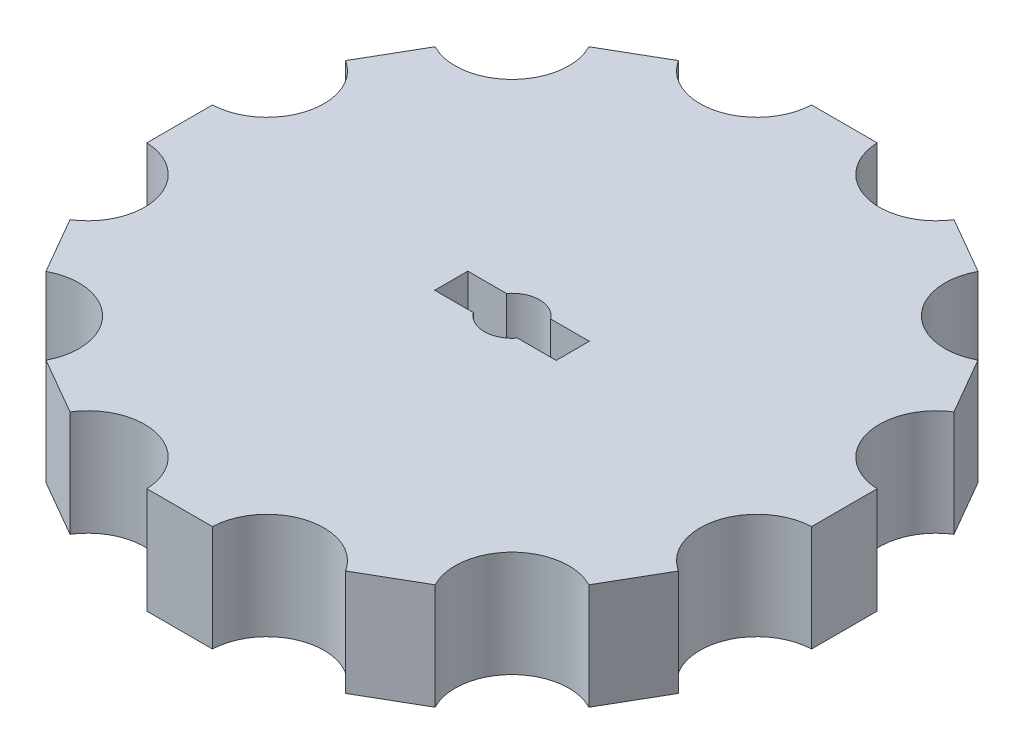
ISO-10303-21;
HEADER;
FILE_DESCRIPTION(('STEP AP214'),'2;1');
FILE_NAME('part.step','',(''),(''),'','','');
FILE_SCHEMA(('AUTOMOTIVE_DESIGN { 1 0 10303 214 1 1 1 1 }'));
ENDSEC;
DATA;
#1=APPLICATION_CONTEXT('core data for automotive mechanical design processes');
#2=APPLICATION_PROTOCOL_DEFINITION('international standard','automotive_design',2000,#1);
#3=PRODUCT_CONTEXT('',#1,'mechanical');
#4=PRODUCT('Part','Part','',(#3));
#5=PRODUCT_RELATED_PRODUCT_CATEGORY('part','',(#4));
#6=PRODUCT_DEFINITION_FORMATION('','',#4);
#7=PRODUCT_DEFINITION_CONTEXT('part definition',#1,'design');
#8=PRODUCT_DEFINITION('design','',#6,#7);
#9=PRODUCT_DEFINITION_SHAPE('','',#8);
#10=(LENGTH_UNIT() NAMED_UNIT(*) SI_UNIT(.MILLI.,.METRE.));
#11=(NAMED_UNIT(*) PLANE_ANGLE_UNIT() SI_UNIT($,.RADIAN.));
#12=(NAMED_UNIT(*) SI_UNIT($,.STERADIAN.) SOLID_ANGLE_UNIT());
#13=UNCERTAINTY_MEASURE_WITH_UNIT(LENGTH_MEASURE(1.E-05),#10,'distance_accuracy_value','');
#14=(GEOMETRIC_REPRESENTATION_CONTEXT(3) GLOBAL_UNCERTAINTY_ASSIGNED_CONTEXT((#13)) GLOBAL_UNIT_ASSIGNED_CONTEXT((#10,
#11,#12)) REPRESENTATION_CONTEXT('',''));
#15=CARTESIAN_POINT('',(0.,0.,0.));
#16=DIRECTION('',(0.,0.,1.));
#17=DIRECTION('',(1.,0.,0.));
#18=AXIS2_PLACEMENT_3D('',#15,#16,#17);
#19=CARTESIAN_POINT('',(-22.1705923034211,9.6,-22.1705923034217));
#20=DIRECTION('',(0.,-1.,0.));
#21=DIRECTION('',(0.,0.,-1.));
#22=AXIS2_PLACEMENT_3D('',#19,#20,#21);
#23=CYLINDRICAL_SURFACE('',#22,5.15);
#24=CARTESIAN_POINT('',(-22.1705923034211,0.,-22.1705923034217));
#25=DIRECTION('',(0.,1.,0.));
#26=DIRECTION('',(0.,0.,1.));
#27=AXIS2_PLACEMENT_3D('',#24,#25,#26);
#28=CIRCLE('',#27,5.15);
#29=CARTESIAN_POINT('',(-24.5704447424256,0.,-17.6139259483981));
#30=VERTEX_POINT('',#29);
#31=CARTESIAN_POINT('',(-17.6139259483974,0.,-24.570444742426));
#32=VERTEX_POINT('',#31);
#33=EDGE_CURVE('E328',#30,#32,#28,.T.);
#34=ORIENTED_EDGE('',*,*,#33,.F.);
#35=DIRECTION('',(0.,-1.,0.));
#36=VECTOR('',#35,1.);
#37=CARTESIAN_POINT('',(-24.5704447424256,9.6,-17.6139259483981));
#38=LINE('',#37,#36);
#39=CARTESIAN_POINT('',(-24.5704447424256,9.6,-17.6139259483981));
#40=VERTEX_POINT('',#39);
#41=EDGE_CURVE('E11',#40,#30,#38,.T.);
#42=ORIENTED_EDGE('',*,*,#41,.F.);
#43=CARTESIAN_POINT('',(-22.1705923034211,9.6,-22.1705923034217));
#44=DIRECTION('',(0.,1.,0.));
#45=DIRECTION('',(0.,0.,1.));
#46=AXIS2_PLACEMENT_3D('',#43,#44,#45);
#47=CIRCLE('',#46,5.15);
#48=CARTESIAN_POINT('',(-17.6139259483974,9.6,-24.570444742426));
#49=VERTEX_POINT('',#48);
#50=EDGE_CURVE('E346',#40,#49,#47,.T.);
#51=ORIENTED_EDGE('',*,*,#50,.T.);
#52=DIRECTION('',(0.,-1.,0.));
#53=VECTOR('',#52,1.);
#54=CARTESIAN_POINT('',(-17.6139259483974,9.6,-24.570444742426));
#55=LINE('',#54,#53);
#56=EDGE_CURVE('E431',#49,#32,#55,.T.);
#57=ORIENTED_EDGE('',*,*,#56,.T.);
#58=EDGE_LOOP('',(#34,#42,#51,#57));
#59=FACE_BOUND('',#58,.T.);
#60=ADVANCED_FACE('F45',(#59),#23,.F.);
#61=CARTESIAN_POINT('',(-26.0548872226646,9.6,-15.0427961517107));
#62=DIRECTION('',(0.866025403784438,0.,0.5));
#63=DIRECTION('',(0.500000000000001,0.,-0.866025403784438));
#64=AXIS2_PLACEMENT_3D('',#61,#62,#63);
#65=PLANE('',#64);
#66=DIRECTION('',(-0.500000000000001,0.,0.866025403784438));
#67=VECTOR('',#66,1.);
#68=CARTESIAN_POINT('',(-26.0548872226646,0.,-15.0427961517107));
#69=LINE('',#68,#67);
#70=CARTESIAN_POINT('',(-27.5393297029031,0.,-12.471666355024));
#71=VERTEX_POINT('',#70);
#72=EDGE_CURVE('E435',#30,#71,#69,.T.);
#73=ORIENTED_EDGE('',*,*,#72,.T.);
#74=DIRECTION('',(0.,-1.,0.));
#75=VECTOR('',#74,1.);
#76=CARTESIAN_POINT('',(-27.5393297029031,9.6,-12.471666355024));
#77=LINE('',#76,#75);
#78=CARTESIAN_POINT('',(-27.5393297029031,9.6,-12.471666355024));
#79=VERTEX_POINT('',#78);
#80=EDGE_CURVE('E53',#79,#71,#77,.T.);
#81=ORIENTED_EDGE('',*,*,#80,.F.);
#82=DIRECTION('',(-0.500000000000001,0.,0.866025403784438));
#83=VECTOR('',#82,1.);
#84=CARTESIAN_POINT('',(-26.0548872226646,9.6,-15.0427961517107));
#85=LINE('',#84,#83);
#86=EDGE_CURVE('E350',#40,#79,#85,.T.);
#87=ORIENTED_EDGE('',*,*,#86,.F.);
#88=ORIENTED_EDGE('',*,*,#41,.T.);
#89=EDGE_LOOP('',(#73,#81,#87,#88));
#90=FACE_BOUND('',#89,.T.);
#91=ADVANCED_FACE('F599',(#90),#65,.F.);
#92=CARTESIAN_POINT('',(-30.2855923034213,9.6,-8.11500000000034));
#93=DIRECTION('',(0.,-1.,0.));
#94=DIRECTION('',(0.,0.,-1.));
#95=AXIS2_PLACEMENT_3D('',#92,#93,#94);
#96=CYLINDRICAL_SURFACE('',#95,5.15);
#97=CARTESIAN_POINT('',(-30.2855923034213,0.,-8.11500000000034));
#98=DIRECTION('',(0.,1.,0.));
#99=DIRECTION('',(0.,0.,1.));
#100=AXIS2_PLACEMENT_3D('',#97,#98,#99);
#101=CIRCLE('',#100,5.15);
#102=CARTESIAN_POINT('',(-30.0855923034215,0.,-2.9688849604778));
#103=VERTEX_POINT('',#102);
#104=EDGE_CURVE('E439',#103,#71,#101,.T.);
#105=ORIENTED_EDGE('',*,*,#104,.F.);
#106=DIRECTION('',(0.,-1.,0.));
#107=VECTOR('',#106,1.);
#108=CARTESIAN_POINT('',(-30.0855923034215,9.6,-2.9688849604778));
#109=LINE('',#108,#107);
#110=CARTESIAN_POINT('',(-30.0855923034215,9.6,-2.9688849604778));
#111=VERTEX_POINT('',#110);
#112=EDGE_CURVE('E588',#111,#103,#109,.T.);
#113=ORIENTED_EDGE('',*,*,#112,.F.);
#114=CARTESIAN_POINT('',(-30.2855923034213,9.6,-8.11500000000034));
#115=DIRECTION('',(0.,1.,0.));
#116=DIRECTION('',(0.,0.,1.));
#117=AXIS2_PLACEMENT_3D('',#114,#115,#116);
#118=CIRCLE('',#117,5.15);
#119=EDGE_CURVE('E354',#111,#79,#118,.T.);
#120=ORIENTED_EDGE('',*,*,#119,.T.);
#121=ORIENTED_EDGE('',*,*,#80,.T.);
#122=EDGE_LOOP('',(#105,#113,#120,#121));
#123=FACE_BOUND('',#122,.T.);
#124=ADVANCED_FACE('F594',(#123),#96,.F.);
#125=CARTESIAN_POINT('',(-30.0855923034215,9.6,2.38238105315562E-13));
#126=DIRECTION('',(1.,0.,0.));
#127=DIRECTION('',(0.,0.,-1.));
#128=AXIS2_PLACEMENT_3D('',#125,#126,#127);
#129=PLANE('',#128);
#130=DIRECTION('',(0.,0.,1.));
#131=VECTOR('',#130,1.);
#132=CARTESIAN_POINT('',(-30.0855923034215,0.,2.38238105315562E-13));
#133=LINE('',#132,#131);
#134=CARTESIAN_POINT('',(-30.0855923034214,0.,2.96888496047715));
#135=VERTEX_POINT('',#134);
#136=EDGE_CURVE('E443',#103,#135,#133,.T.);
#137=ORIENTED_EDGE('',*,*,#136,.T.);
#138=DIRECTION('',(0.,-1.,0.));
#139=VECTOR('',#138,1.);
#140=CARTESIAN_POINT('',(-30.0855923034214,9.6,2.96888496047715));
#141=LINE('',#140,#139);
#142=CARTESIAN_POINT('',(-30.0855923034214,9.6,2.96888496047715));
#143=VERTEX_POINT('',#142);
#144=EDGE_CURVE('E585',#143,#135,#141,.T.);
#145=ORIENTED_EDGE('',*,*,#144,.F.);
#146=DIRECTION('',(0.,0.,1.));
#147=VECTOR('',#146,1.);
#148=CARTESIAN_POINT('',(-30.0855923034215,9.6,2.38238105315562E-13));
#149=LINE('',#148,#147);
#150=EDGE_CURVE('E358',#111,#143,#149,.T.);
#151=ORIENTED_EDGE('',*,*,#150,.F.);
#152=ORIENTED_EDGE('',*,*,#112,.T.);
#153=EDGE_LOOP('',(#137,#145,#151,#152));
#154=FACE_BOUND('',#153,.T.);
#155=ADVANCED_FACE('F606',(#154),#129,.F.);
#156=CARTESIAN_POINT('',(-30.2855923034215,9.6,8.11499999999968));
#157=DIRECTION('',(0.,-1.,0.));
#158=DIRECTION('',(0.,0.,-1.));
#159=AXIS2_PLACEMENT_3D('',#156,#157,#158);
#160=CYLINDRICAL_SURFACE('',#159,5.15);
#161=CARTESIAN_POINT('',(-30.2855923034215,0.,8.11499999999968));
#162=DIRECTION('',(0.,1.,0.));
#163=DIRECTION('',(0.,0.,1.));
#164=AXIS2_PLACEMENT_3D('',#161,#162,#163);
#165=CIRCLE('',#164,5.15);
#166=CARTESIAN_POINT('',(-27.5393297029035,0.,12.4716663550235));
#167=VERTEX_POINT('',#166);
#168=EDGE_CURVE('E447',#167,#135,#165,.T.);
#169=ORIENTED_EDGE('',*,*,#168,.F.);
#170=DIRECTION('',(0.,-1.,0.));
#171=VECTOR('',#170,1.);
#172=CARTESIAN_POINT('',(-27.5393297029035,9.6,12.4716663550235));
#173=LINE('',#172,#171);
#174=CARTESIAN_POINT('',(-27.5393297029035,9.6,12.4716663550235));
#175=VERTEX_POINT('',#174);
#176=EDGE_CURVE('E582',#175,#167,#173,.T.);
#177=ORIENTED_EDGE('',*,*,#176,.F.);
#178=CARTESIAN_POINT('',(-30.2855923034215,9.6,8.11499999999968));
#179=DIRECTION('',(0.,1.,0.));
#180=DIRECTION('',(0.,0.,1.));
#181=AXIS2_PLACEMENT_3D('',#178,#179,#180);
#182=CIRCLE('',#181,5.15);
#183=EDGE_CURVE('E361',#175,#143,#182,.T.);
#184=ORIENTED_EDGE('',*,*,#183,.T.);
#185=ORIENTED_EDGE('',*,*,#144,.T.);
#186=EDGE_LOOP('',(#169,#177,#184,#185));
#187=FACE_BOUND('',#186,.T.);
#188=ADVANCED_FACE('F698',(#187),#160,.F.);
#189=CARTESIAN_POINT('',(-26.0548872226644,9.6,15.0427961517111));
#190=DIRECTION('',(0.866025403784432,0.,-0.500000000000011));
#191=DIRECTION('',(-0.500000000000011,0.,-0.866025403784432));
#192=AXIS2_PLACEMENT_3D('',#189,#190,#191);
#193=PLANE('',#192);
#194=DIRECTION('',(0.500000000000011,0.,0.866025403784432));
#195=VECTOR('',#194,1.);
#196=CARTESIAN_POINT('',(-26.0548872226644,0.,15.0427961517111));
#197=LINE('',#196,#195);
#198=CARTESIAN_POINT('',(-24.570444742426,0.,17.6139259483975));
#199=VERTEX_POINT('',#198);
#200=EDGE_CURVE('E451',#167,#199,#197,.T.);
#201=ORIENTED_EDGE('',*,*,#200,.T.);
#202=DIRECTION('',(0.,-1.,0.));
#203=VECTOR('',#202,1.);
#204=CARTESIAN_POINT('',(-24.570444742426,9.6,17.6139259483975));
#205=LINE('',#204,#203);
#206=CARTESIAN_POINT('',(-24.570444742426,9.6,17.6139259483975));
#207=VERTEX_POINT('',#206);
#208=EDGE_CURVE('E579',#207,#199,#205,.T.);
#209=ORIENTED_EDGE('',*,*,#208,.F.);
#210=DIRECTION('',(0.500000000000011,0.,0.866025403784432));
#211=VECTOR('',#210,1.);
#212=CARTESIAN_POINT('',(-26.0548872226644,9.6,15.0427961517111));
#213=LINE('',#212,#211);
#214=EDGE_CURVE('E365',#175,#207,#213,.T.);
#215=ORIENTED_EDGE('',*,*,#214,.F.);
#216=ORIENTED_EDGE('',*,*,#176,.T.);
#217=EDGE_LOOP('',(#201,#209,#215,#216));
#218=FACE_BOUND('',#217,.T.);
#219=ADVANCED_FACE('F696',(#218),#193,.F.);
#220=CARTESIAN_POINT('',(-22.1705923034216,9.6,22.1705923034212));
#221=DIRECTION('',(0.,-1.,0.));
#222=DIRECTION('',(0.,0.,-1.));
#223=AXIS2_PLACEMENT_3D('',#220,#221,#222);
#224=CYLINDRICAL_SURFACE('',#223,5.15);
#225=CARTESIAN_POINT('',(-22.1705923034216,0.,22.1705923034212));
#226=DIRECTION('',(0.,1.,0.));
#227=DIRECTION('',(0.,0.,1.));
#228=AXIS2_PLACEMENT_3D('',#225,#226,#227);
#229=CIRCLE('',#228,5.15);
#230=CARTESIAN_POINT('',(-17.613925948398,0.,24.5704447424258));
#231=VERTEX_POINT('',#230);
#232=EDGE_CURVE('E455',#231,#199,#229,.T.);
#233=ORIENTED_EDGE('',*,*,#232,.F.);
#234=DIRECTION('',(0.,-1.,0.));
#235=VECTOR('',#234,1.);
#236=CARTESIAN_POINT('',(-17.613925948398,9.6,24.5704447424258));
#237=LINE('',#236,#235);
#238=CARTESIAN_POINT('',(-17.613925948398,9.6,24.5704447424258));
#239=VERTEX_POINT('',#238);
#240=EDGE_CURVE('E576',#239,#231,#237,.T.);
#241=ORIENTED_EDGE('',*,*,#240,.F.);
#242=CARTESIAN_POINT('',(-22.1705923034216,9.6,22.1705923034212));
#243=DIRECTION('',(0.,1.,0.));
#244=DIRECTION('',(0.,0.,1.));
#245=AXIS2_PLACEMENT_3D('',#242,#243,#244);
#246=CIRCLE('',#245,5.15);
#247=EDGE_CURVE('E368',#239,#207,#246,.T.);
#248=ORIENTED_EDGE('',*,*,#247,.T.);
#249=ORIENTED_EDGE('',*,*,#208,.T.);
#250=EDGE_LOOP('',(#233,#241,#248,#249));
#251=FACE_BOUND('',#250,.T.);
#252=ADVANCED_FACE('F691',(#251),#224,.F.);
#253=CARTESIAN_POINT('',(-15.0427961517103,9.6,26.0548872226648));
#254=DIRECTION('',(0.499999999999986,0.,-0.866025403784447));
#255=DIRECTION('',(-0.866025403784447,0.,-0.499999999999986));
#256=AXIS2_PLACEMENT_3D('',#253,#254,#255);
#257=PLANE('',#256);
#258=DIRECTION('',(0.866025403784447,0.,0.499999999999986));
#259=VECTOR('',#258,1.);
#260=CARTESIAN_POINT('',(-15.0427961517103,0.,26.0548872226648));
#261=LINE('',#260,#259);
#262=CARTESIAN_POINT('',(-12.4716663550239,0.,27.5393297029031));
#263=VERTEX_POINT('',#262);
#264=EDGE_CURVE('E459',#231,#263,#261,.T.);
#265=ORIENTED_EDGE('',*,*,#264,.T.);
#266=DIRECTION('',(0.,-1.,0.));
#267=VECTOR('',#266,1.);
#268=CARTESIAN_POINT('',(-12.4716663550239,9.6,27.5393297029031));
#269=LINE('',#268,#267);
#270=CARTESIAN_POINT('',(-12.4716663550239,9.6,27.5393297029031));
#271=VERTEX_POINT('',#270);
#272=EDGE_CURVE('E573',#271,#263,#269,.T.);
#273=ORIENTED_EDGE('',*,*,#272,.F.);
#274=DIRECTION('',(0.866025403784447,0.,0.499999999999986));
#275=VECTOR('',#274,1.);
#276=CARTESIAN_POINT('',(-15.0427961517103,9.6,26.0548872226648));
#277=LINE('',#276,#275);
#278=EDGE_CURVE('E372',#239,#271,#277,.T.);
#279=ORIENTED_EDGE('',*,*,#278,.F.);
#280=ORIENTED_EDGE('',*,*,#240,.T.);
#281=EDGE_LOOP('',(#265,#273,#279,#280));
#282=FACE_BOUND('',#281,.T.);
#283=ADVANCED_FACE('F688',(#282),#257,.F.);
#284=CARTESIAN_POINT('',(-8.11500000000024,9.6,30.2855923034213));
#285=DIRECTION('',(0.,-1.,0.));
#286=DIRECTION('',(0.,0.,-1.));
#287=AXIS2_PLACEMENT_3D('',#284,#285,#286);
#288=CYLINDRICAL_SURFACE('',#287,5.15);
#289=CARTESIAN_POINT('',(-8.11500000000024,0.,30.2855923034213));
#290=DIRECTION('',(0.,1.,0.));
#291=DIRECTION('',(0.,0.,1.));
#292=AXIS2_PLACEMENT_3D('',#289,#290,#291);
#293=CIRCLE('',#292,5.15);
#294=CARTESIAN_POINT('',(-2.9688849604777,0.,30.0855923034215));
#295=VERTEX_POINT('',#294);
#296=EDGE_CURVE('E463',#295,#263,#293,.T.);
#297=ORIENTED_EDGE('',*,*,#296,.F.);
#298=DIRECTION('',(0.,-1.,0.));
#299=VECTOR('',#298,1.);
#300=CARTESIAN_POINT('',(-2.9688849604777,9.6,30.0855923034215));
#301=LINE('',#300,#299);
#302=CARTESIAN_POINT('',(-2.9688849604777,9.6,30.0855923034215));
#303=VERTEX_POINT('',#302);
#304=EDGE_CURVE('E570',#303,#295,#301,.T.);
#305=ORIENTED_EDGE('',*,*,#304,.F.);
#306=CARTESIAN_POINT('',(-8.11500000000024,9.6,30.2855923034213));
#307=DIRECTION('',(0.,1.,0.));
#308=DIRECTION('',(0.,0.,1.));
#309=AXIS2_PLACEMENT_3D('',#306,#307,#308);
#310=CIRCLE('',#309,5.15);
#311=EDGE_CURVE('E375',#303,#271,#310,.T.);
#312=ORIENTED_EDGE('',*,*,#311,.T.);
#313=ORIENTED_EDGE('',*,*,#272,.T.);
#314=EDGE_LOOP('',(#297,#305,#312,#313));
#315=FACE_BOUND('',#314,.T.);
#316=ADVANCED_FACE('F683',(#315),#288,.F.);
#317=CARTESIAN_POINT('',(4.42442195586083E-13,9.6,30.0855923034215));
#318=DIRECTION('',(0.,0.,-1.));
#319=DIRECTION('',(-1.,0.,0.));
#320=AXIS2_PLACEMENT_3D('',#317,#318,#319);
#321=PLANE('',#320);
#322=DIRECTION('',(1.,0.,0.));
#323=VECTOR('',#322,1.);
#324=CARTESIAN_POINT('',(4.42442195586083E-13,0.,30.0855923034215));
#325=LINE('',#324,#323);
#326=CARTESIAN_POINT('',(2.96888496047725,0.,30.0855923034214));
#327=VERTEX_POINT('',#326);
#328=EDGE_CURVE('E467',#295,#327,#325,.T.);
#329=ORIENTED_EDGE('',*,*,#328,.T.);
#330=DIRECTION('',(0.,-1.,0.));
#331=VECTOR('',#330,1.);
#332=CARTESIAN_POINT('',(2.96888496047725,9.6,30.0855923034214));
#333=LINE('',#332,#331);
#334=CARTESIAN_POINT('',(2.96888496047725,9.6,30.0855923034214));
#335=VERTEX_POINT('',#334);
#336=EDGE_CURVE('E567',#335,#327,#333,.T.);
#337=ORIENTED_EDGE('',*,*,#336,.F.);
#338=DIRECTION('',(1.,0.,0.));
#339=VECTOR('',#338,1.);
#340=CARTESIAN_POINT('',(4.42442195586083E-13,9.6,30.0855923034215));
#341=LINE('',#340,#339);
#342=EDGE_CURVE('E379',#303,#335,#341,.T.);
#343=ORIENTED_EDGE('',*,*,#342,.F.);
#344=ORIENTED_EDGE('',*,*,#304,.T.);
#345=EDGE_LOOP('',(#329,#337,#343,#344));
#346=FACE_BOUND('',#345,.T.);
#347=ADVANCED_FACE('F679',(#346),#321,.F.);
#348=CARTESIAN_POINT('',(8.11499999999978,9.6,30.2855923034215));
#349=DIRECTION('',(0.,-1.,0.));
#350=DIRECTION('',(0.,0.,-1.));
#351=AXIS2_PLACEMENT_3D('',#348,#349,#350);
#352=CYLINDRICAL_SURFACE('',#351,5.15);
#353=CARTESIAN_POINT('',(8.11499999999978,0.,30.2855923034215));
#354=DIRECTION('',(0.,1.,0.));
#355=DIRECTION('',(0.,0.,1.));
#356=AXIS2_PLACEMENT_3D('',#353,#354,#355);
#357=CIRCLE('',#356,5.15);
#358=CARTESIAN_POINT('',(12.4716663550235,0.,27.5393297029034));
#359=VERTEX_POINT('',#358);
#360=EDGE_CURVE('E471',#359,#327,#357,.T.);
#361=ORIENTED_EDGE('',*,*,#360,.F.);
#362=DIRECTION('',(0.,-1.,0.));
#363=VECTOR('',#362,1.);
#364=CARTESIAN_POINT('',(12.4716663550235,9.6,27.5393297029034));
#365=LINE('',#364,#363);
#366=CARTESIAN_POINT('',(12.4716663550235,9.6,27.5393297029034));
#367=VERTEX_POINT('',#366);
#368=EDGE_CURVE('E564',#367,#359,#365,.T.);
#369=ORIENTED_EDGE('',*,*,#368,.F.);
#370=CARTESIAN_POINT('',(8.11499999999978,9.6,30.2855923034215));
#371=DIRECTION('',(0.,1.,0.));
#372=DIRECTION('',(0.,0.,1.));
#373=AXIS2_PLACEMENT_3D('',#370,#371,#372);
#374=CIRCLE('',#373,5.15);
#375=EDGE_CURVE('E382',#367,#335,#374,.T.);
#376=ORIENTED_EDGE('',*,*,#375,.T.);
#377=ORIENTED_EDGE('',*,*,#336,.T.);
#378=EDGE_LOOP('',(#361,#369,#376,#377));
#379=FACE_BOUND('',#378,.T.);
#380=ADVANCED_FACE('F674',(#379),#352,.F.);
#381=CARTESIAN_POINT('',(15.0427961517111,9.6,26.0548872226644));
#382=DIRECTION('',(-0.500000000000011,0.,-0.866025403784432));
#383=DIRECTION('',(-0.866025403784432,0.,0.500000000000011));
#384=AXIS2_PLACEMENT_3D('',#381,#382,#383);
#385=PLANE('',#384);
#386=DIRECTION('',(0.866025403784432,0.,-0.500000000000011));
#387=VECTOR('',#386,1.);
#388=CARTESIAN_POINT('',(15.0427961517111,0.,26.0548872226644));
#389=LINE('',#388,#387);
#390=CARTESIAN_POINT('',(17.6139259483976,0.,24.5704447424259));
#391=VERTEX_POINT('',#390);
#392=EDGE_CURVE('E475',#359,#391,#389,.T.);
#393=ORIENTED_EDGE('',*,*,#392,.T.);
#394=DIRECTION('',(0.,-1.,0.));
#395=VECTOR('',#394,1.);
#396=CARTESIAN_POINT('',(17.6139259483976,9.6,24.5704447424259));
#397=LINE('',#396,#395);
#398=CARTESIAN_POINT('',(17.6139259483976,9.6,24.5704447424259));
#399=VERTEX_POINT('',#398);
#400=EDGE_CURVE('E561',#399,#391,#397,.T.);
#401=ORIENTED_EDGE('',*,*,#400,.F.);
#402=DIRECTION('',(0.866025403784432,0.,-0.500000000000011));
#403=VECTOR('',#402,1.);
#404=CARTESIAN_POINT('',(15.0427961517111,9.6,26.0548872226644));
#405=LINE('',#404,#403);
#406=EDGE_CURVE('E386',#367,#399,#405,.T.);
#407=ORIENTED_EDGE('',*,*,#406,.F.);
#408=ORIENTED_EDGE('',*,*,#368,.T.);
#409=EDGE_LOOP('',(#393,#401,#407,#408));
#410=FACE_BOUND('',#409,.T.);
#411=ADVANCED_FACE('F670',(#410),#385,.F.);
#412=CARTESIAN_POINT('',(22.1705923034213,9.6,22.1705923034215));
#413=DIRECTION('',(0.,-1.,0.));
#414=DIRECTION('',(0.,0.,-1.));
#415=AXIS2_PLACEMENT_3D('',#412,#413,#414);
#416=CYLINDRICAL_SURFACE('',#415,5.15);
#417=CARTESIAN_POINT('',(22.1705923034213,0.,22.1705923034215));
#418=DIRECTION('',(0.,1.,0.));
#419=DIRECTION('',(0.,0.,1.));
#420=AXIS2_PLACEMENT_3D('',#417,#418,#419);
#421=CIRCLE('',#420,5.15);
#422=CARTESIAN_POINT('',(24.5704447424257,0.,17.6139259483979));
#423=VERTEX_POINT('',#422);
#424=EDGE_CURVE('E479',#423,#391,#421,.T.);
#425=ORIENTED_EDGE('',*,*,#424,.F.);
#426=DIRECTION('',(0.,-1.,0.));
#427=VECTOR('',#426,1.);
#428=CARTESIAN_POINT('',(24.5704447424257,9.6,17.6139259483979));
#429=LINE('',#428,#427);
#430=CARTESIAN_POINT('',(24.5704447424257,9.6,17.6139259483979));
#431=VERTEX_POINT('',#430);
#432=EDGE_CURVE('E558',#431,#423,#429,.T.);
#433=ORIENTED_EDGE('',*,*,#432,.F.);
#434=CARTESIAN_POINT('',(22.1705923034213,9.6,22.1705923034215));
#435=DIRECTION('',(0.,1.,0.));
#436=DIRECTION('',(0.,0.,1.));
#437=AXIS2_PLACEMENT_3D('',#434,#435,#436);
#438=CIRCLE('',#437,5.15);
#439=EDGE_CURVE('E389',#431,#399,#438,.T.);
#440=ORIENTED_EDGE('',*,*,#439,.T.);
#441=ORIENTED_EDGE('',*,*,#400,.T.);
#442=EDGE_LOOP('',(#425,#433,#440,#441));
#443=FACE_BOUND('',#442,.T.);
#444=ADVANCED_FACE('F665',(#443),#416,.F.);
#445=CARTESIAN_POINT('',(26.0548872226646,9.6,15.0427961517106));
#446=DIRECTION('',(-0.86602540378444,0.,-0.499999999999997));
#447=DIRECTION('',(-0.499999999999997,0.,0.86602540378444));
#448=AXIS2_PLACEMENT_3D('',#445,#446,#447);
#449=PLANE('',#448);
#450=DIRECTION('',(0.499999999999997,0.,-0.86602540378444));
#451=VECTOR('',#450,1.);
#452=CARTESIAN_POINT('',(26.0548872226646,0.,15.0427961517106));
#453=LINE('',#452,#451);
#454=CARTESIAN_POINT('',(27.5393297029032,0.,12.4716663550238));
#455=VERTEX_POINT('',#454);
#456=EDGE_CURVE('E483',#423,#455,#453,.T.);
#457=ORIENTED_EDGE('',*,*,#456,.T.);
#458=DIRECTION('',(0.,-1.,0.));
#459=VECTOR('',#458,1.);
#460=CARTESIAN_POINT('',(27.5393297029032,9.6,12.4716663550238));
#461=LINE('',#460,#459);
#462=CARTESIAN_POINT('',(27.5393297029032,9.6,12.4716663550238));
#463=VERTEX_POINT('',#462);
#464=EDGE_CURVE('E555',#463,#455,#461,.T.);
#465=ORIENTED_EDGE('',*,*,#464,.F.);
#466=DIRECTION('',(0.499999999999997,0.,-0.86602540378444));
#467=VECTOR('',#466,1.);
#468=CARTESIAN_POINT('',(26.0548872226646,9.6,15.0427961517106));
#469=LINE('',#468,#467);
#470=EDGE_CURVE('E393',#431,#463,#469,.T.);
#471=ORIENTED_EDGE('',*,*,#470,.F.);
#472=ORIENTED_EDGE('',*,*,#432,.T.);
#473=EDGE_LOOP('',(#457,#465,#471,#472));
#474=FACE_BOUND('',#473,.T.);
#475=ADVANCED_FACE('F661',(#474),#449,.F.);
#476=CARTESIAN_POINT('',(30.2855923034214,9.6,8.11500000000014));
#477=DIRECTION('',(0.,-1.,0.));
#478=DIRECTION('',(0.,0.,-1.));
#479=AXIS2_PLACEMENT_3D('',#476,#477,#478);
#480=CYLINDRICAL_SURFACE('',#479,5.15);
#481=CARTESIAN_POINT('',(30.2855923034214,0.,8.11500000000014));
#482=DIRECTION('',(0.,1.,0.));
#483=DIRECTION('',(0.,0.,1.));
#484=AXIS2_PLACEMENT_3D('',#481,#482,#483);
#485=CIRCLE('',#484,5.15);
#486=CARTESIAN_POINT('',(30.0855923034214,0.,2.9688849604776));
#487=VERTEX_POINT('',#486);
#488=EDGE_CURVE('E487',#487,#455,#485,.T.);
#489=ORIENTED_EDGE('',*,*,#488,.F.);
#490=DIRECTION('',(0.,-1.,0.));
#491=VECTOR('',#490,1.);
#492=CARTESIAN_POINT('',(30.0855923034214,9.6,2.9688849604776));
#493=LINE('',#492,#491);
#494=CARTESIAN_POINT('',(30.0855923034214,9.6,2.9688849604776));
#495=VERTEX_POINT('',#494);
#496=EDGE_CURVE('E552',#495,#487,#493,.T.);
#497=ORIENTED_EDGE('',*,*,#496,.F.);
#498=CARTESIAN_POINT('',(30.2855923034214,9.6,8.11500000000014));
#499=DIRECTION('',(0.,1.,0.));
#500=DIRECTION('',(0.,0.,1.));
#501=AXIS2_PLACEMENT_3D('',#498,#499,#500);
#502=CIRCLE('',#501,5.15);
#503=EDGE_CURVE('E396',#495,#463,#502,.T.);
#504=ORIENTED_EDGE('',*,*,#503,.T.);
#505=ORIENTED_EDGE('',*,*,#464,.T.);
#506=EDGE_LOOP('',(#489,#497,#504,#505));
#507=FACE_BOUND('',#506,.T.);
#508=ADVANCED_FACE('F656',(#507),#480,.F.);
#509=CARTESIAN_POINT('',(30.0855923034214,9.6,-1.23053364365836E-13));
#510=DIRECTION('',(-1.,0.,0.));
#511=DIRECTION('',(0.,0.,1.));
#512=AXIS2_PLACEMENT_3D('',#509,#510,#511);
#513=PLANE('',#512);
#514=DIRECTION('',(0.,0.,-1.));
#515=VECTOR('',#514,1.);
#516=CARTESIAN_POINT('',(30.0855923034214,0.,-1.23053364365836E-13));
#517=LINE('',#516,#515);
#518=CARTESIAN_POINT('',(30.0855923034214,0.,-2.96888496047736));
#519=VERTEX_POINT('',#518);
#520=EDGE_CURVE('E491',#487,#519,#517,.T.);
#521=ORIENTED_EDGE('',*,*,#520,.T.);
#522=DIRECTION('',(0.,-1.,0.));
#523=VECTOR('',#522,1.);
#524=CARTESIAN_POINT('',(30.0855923034214,9.6,-2.96888496047736));
#525=LINE('',#524,#523);
#526=CARTESIAN_POINT('',(30.0855923034214,9.6,-2.96888496047736));
#527=VERTEX_POINT('',#526);
#528=EDGE_CURVE('E549',#527,#519,#525,.T.);
#529=ORIENTED_EDGE('',*,*,#528,.F.);
#530=DIRECTION('',(0.,0.,-1.));
#531=VECTOR('',#530,1.);
#532=CARTESIAN_POINT('',(30.0855923034214,9.6,-1.23053364365836E-13));
#533=LINE('',#532,#531);
#534=EDGE_CURVE('E400',#495,#527,#533,.T.);
#535=ORIENTED_EDGE('',*,*,#534,.F.);
#536=ORIENTED_EDGE('',*,*,#496,.T.);
#537=EDGE_LOOP('',(#521,#529,#535,#536));
#538=FACE_BOUND('',#537,.T.);
#539=ADVANCED_FACE('F652',(#538),#513,.F.);
#540=CARTESIAN_POINT('',(30.2855923034214,9.6,-8.11499999999989));
#541=DIRECTION('',(0.,-1.,0.));
#542=DIRECTION('',(0.,0.,-1.));
#543=AXIS2_PLACEMENT_3D('',#540,#541,#542);
#544=CYLINDRICAL_SURFACE('',#543,5.15);
#545=CARTESIAN_POINT('',(30.2855923034214,0.,-8.11499999999989));
#546=DIRECTION('',(0.,1.,0.));
#547=DIRECTION('',(0.,0.,1.));
#548=AXIS2_PLACEMENT_3D('',#545,#546,#547);
#549=CIRCLE('',#548,5.15);
#550=CARTESIAN_POINT('',(27.5393297029033,0.,-12.4716663550236));
#551=VERTEX_POINT('',#550);
#552=EDGE_CURVE('E495',#551,#519,#549,.T.);
#553=ORIENTED_EDGE('',*,*,#552,.F.);
#554=DIRECTION('',(0.,-1.,0.));
#555=VECTOR('',#554,1.);
#556=CARTESIAN_POINT('',(27.5393297029033,9.6,-12.4716663550236));
#557=LINE('',#556,#555);
#558=CARTESIAN_POINT('',(27.5393297029033,9.6,-12.4716663550236));
#559=VERTEX_POINT('',#558);
#560=EDGE_CURVE('E546',#559,#551,#557,.T.);
#561=ORIENTED_EDGE('',*,*,#560,.F.);
#562=CARTESIAN_POINT('',(30.2855923034214,9.6,-8.11499999999989));
#563=DIRECTION('',(0.,1.,0.));
#564=DIRECTION('',(0.,0.,1.));
#565=AXIS2_PLACEMENT_3D('',#562,#563,#564);
#566=CIRCLE('',#565,5.15);
#567=EDGE_CURVE('E403',#559,#527,#566,.T.);
#568=ORIENTED_EDGE('',*,*,#567,.T.);
#569=ORIENTED_EDGE('',*,*,#528,.T.);
#570=EDGE_LOOP('',(#553,#561,#568,#569));
#571=FACE_BOUND('',#570,.T.);
#572=ADVANCED_FACE('F647',(#571),#544,.F.);
#573=CARTESIAN_POINT('',(26.0548872226646,9.6,-15.0427961517106));
#574=DIRECTION('',(-0.86602540378444,0.,0.499999999999998));
#575=DIRECTION('',(0.499999999999998,0.,0.86602540378444));
#576=AXIS2_PLACEMENT_3D('',#573,#574,#575);
#577=PLANE('',#576);
#578=DIRECTION('',(-0.499999999999998,0.,-0.86602540378444));
#579=VECTOR('',#578,1.);
#580=CARTESIAN_POINT('',(26.0548872226646,0.,-15.0427961517106));
#581=LINE('',#580,#579);
#582=CARTESIAN_POINT('',(24.5704447424258,0.,-17.6139259483977));
#583=VERTEX_POINT('',#582);
#584=EDGE_CURVE('E499',#551,#583,#581,.T.);
#585=ORIENTED_EDGE('',*,*,#584,.T.);
#586=DIRECTION('',(0.,-1.,0.));
#587=VECTOR('',#586,1.);
#588=CARTESIAN_POINT('',(24.5704447424258,9.6,-17.6139259483977));
#589=LINE('',#588,#587);
#590=CARTESIAN_POINT('',(24.5704447424258,9.6,-17.6139259483977));
#591=VERTEX_POINT('',#590);
#592=EDGE_CURVE('E543',#591,#583,#589,.T.);
#593=ORIENTED_EDGE('',*,*,#592,.F.);
#594=DIRECTION('',(-0.499999999999998,0.,-0.86602540378444));
#595=VECTOR('',#594,1.);
#596=CARTESIAN_POINT('',(26.0548872226646,9.6,-15.0427961517106));
#597=LINE('',#596,#595);
#598=EDGE_CURVE('E407',#559,#591,#597,.T.);
#599=ORIENTED_EDGE('',*,*,#598,.F.);
#600=ORIENTED_EDGE('',*,*,#560,.T.);
#601=EDGE_LOOP('',(#585,#593,#599,#600));
#602=FACE_BOUND('',#601,.T.);
#603=ADVANCED_FACE('F643',(#602),#577,.F.);
#604=CARTESIAN_POINT('',(22.1705923034215,9.6,-22.1705923034214));
#605=DIRECTION('',(0.,-1.,0.));
#606=DIRECTION('',(0.,0.,-1.));
#607=AXIS2_PLACEMENT_3D('',#604,#605,#606);
#608=CYLINDRICAL_SURFACE('',#607,5.15);
#609=CARTESIAN_POINT('',(22.1705923034215,0.,-22.1705923034214));
#610=DIRECTION('',(0.,1.,0.));
#611=DIRECTION('',(0.,0.,1.));
#612=AXIS2_PLACEMENT_3D('',#609,#610,#611);
#613=CIRCLE('',#612,5.15);
#614=CARTESIAN_POINT('',(17.6139259483978,0.,-24.5704447424258));
#615=VERTEX_POINT('',#614);
#616=EDGE_CURVE('E503',#615,#583,#613,.T.);
#617=ORIENTED_EDGE('',*,*,#616,.F.);
#618=DIRECTION('',(0.,-1.,0.));
#619=VECTOR('',#618,1.);
#620=CARTESIAN_POINT('',(17.6139259483978,9.6,-24.5704447424258));
#621=LINE('',#620,#619);
#622=CARTESIAN_POINT('',(17.6139259483978,9.6,-24.5704447424258));
#623=VERTEX_POINT('',#622);
#624=EDGE_CURVE('E540',#623,#615,#621,.T.);
#625=ORIENTED_EDGE('',*,*,#624,.F.);
#626=CARTESIAN_POINT('',(22.1705923034215,9.6,-22.1705923034214));
#627=DIRECTION('',(0.,1.,0.));
#628=DIRECTION('',(0.,0.,1.));
#629=AXIS2_PLACEMENT_3D('',#626,#627,#628);
#630=CIRCLE('',#629,5.15);
#631=EDGE_CURVE('E410',#623,#591,#630,.T.);
#632=ORIENTED_EDGE('',*,*,#631,.T.);
#633=ORIENTED_EDGE('',*,*,#592,.T.);
#634=EDGE_LOOP('',(#617,#625,#632,#633));
#635=FACE_BOUND('',#634,.T.);
#636=ADVANCED_FACE('F638',(#635),#608,.F.);
#637=CARTESIAN_POINT('',(15.0427961517107,9.6,-26.0548872226645));
#638=DIRECTION('',(-0.500000000000001,0.,0.866025403784438));
#639=DIRECTION('',(0.866025403784438,0.,0.500000000000001));
#640=AXIS2_PLACEMENT_3D('',#637,#638,#639);
#641=PLANE('',#640);
#642=DIRECTION('',(-0.866025403784438,0.,-0.500000000000001));
#643=VECTOR('',#642,1.);
#644=CARTESIAN_POINT('',(15.0427961517107,0.,-26.0548872226645));
#645=LINE('',#644,#643);
#646=CARTESIAN_POINT('',(12.4716663550237,0.,-27.5393297029032));
#647=VERTEX_POINT('',#646);
#648=EDGE_CURVE('E507',#615,#647,#645,.T.);
#649=ORIENTED_EDGE('',*,*,#648,.T.);
#650=DIRECTION('',(0.,-1.,0.));
#651=VECTOR('',#650,1.);
#652=CARTESIAN_POINT('',(12.4716663550237,9.6,-27.5393297029032));
#653=LINE('',#652,#651);
#654=CARTESIAN_POINT('',(12.4716663550237,9.6,-27.5393297029032));
#655=VERTEX_POINT('',#654);
#656=EDGE_CURVE('E537',#655,#647,#653,.T.);
#657=ORIENTED_EDGE('',*,*,#656,.F.);
#658=DIRECTION('',(-0.866025403784438,0.,-0.500000000000001));
#659=VECTOR('',#658,1.);
#660=CARTESIAN_POINT('',(15.0427961517107,9.6,-26.0548872226645));
#661=LINE('',#660,#659);
#662=EDGE_CURVE('E414',#623,#655,#661,.T.);
#663=ORIENTED_EDGE('',*,*,#662,.F.);
#664=ORIENTED_EDGE('',*,*,#624,.T.);
#665=EDGE_LOOP('',(#649,#657,#663,#664));
#666=FACE_BOUND('',#665,.T.);
#667=ADVANCED_FACE('F634',(#666),#641,.F.);
#668=CARTESIAN_POINT('',(8.11500000000002,9.6,-30.2855923034214));
#669=DIRECTION('',(0.,-1.,0.));
#670=DIRECTION('',(0.,0.,-1.));
#671=AXIS2_PLACEMENT_3D('',#668,#669,#670);
#672=CYLINDRICAL_SURFACE('',#671,5.15);
#673=CARTESIAN_POINT('',(8.11500000000002,0.,-30.2855923034214));
#674=DIRECTION('',(0.,1.,0.));
#675=DIRECTION('',(0.,0.,1.));
#676=AXIS2_PLACEMENT_3D('',#673,#674,#675);
#677=CIRCLE('',#676,5.15);
#678=CARTESIAN_POINT('',(2.96888496047749,0.,-30.0855923034214));
#679=VERTEX_POINT('',#678);
#680=EDGE_CURVE('E511',#679,#647,#677,.T.);
#681=ORIENTED_EDGE('',*,*,#680,.F.);
#682=DIRECTION('',(0.,-1.,0.));
#683=VECTOR('',#682,1.);
#684=CARTESIAN_POINT('',(2.96888496047749,9.6,-30.0855923034214));
#685=LINE('',#684,#683);
#686=CARTESIAN_POINT('',(2.96888496047749,9.6,-30.0855923034214));
#687=VERTEX_POINT('',#686);
#688=EDGE_CURVE('E534',#687,#679,#685,.T.);
#689=ORIENTED_EDGE('',*,*,#688,.F.);
#690=CARTESIAN_POINT('',(8.11500000000002,9.6,-30.2855923034214));
#691=DIRECTION('',(0.,1.,0.));
#692=DIRECTION('',(0.,0.,1.));
#693=AXIS2_PLACEMENT_3D('',#690,#691,#692);
#694=CIRCLE('',#693,5.15);
#695=EDGE_CURVE('E417',#687,#655,#694,.T.);
#696=ORIENTED_EDGE('',*,*,#695,.T.);
#697=ORIENTED_EDGE('',*,*,#656,.T.);
#698=EDGE_LOOP('',(#681,#689,#696,#697));
#699=FACE_BOUND('',#698,.T.);
#700=ADVANCED_FACE('F629',(#699),#672,.F.);
#701=CARTESIAN_POINT('',(0.,9.6,-30.0855923034214));
#702=DIRECTION('',(0.,0.,1.));
#703=DIRECTION('',(1.,0.,0.));
#704=AXIS2_PLACEMENT_3D('',#701,#702,#703);
#705=PLANE('',#704);
#706=DIRECTION('',(-1.,0.,0.));
#707=VECTOR('',#706,1.);
#708=CARTESIAN_POINT('',(0.,0.,-30.0855923034214));
#709=LINE('',#708,#707);
#710=CARTESIAN_POINT('',(-2.96888496047746,0.,-30.0855923034214));
#711=VERTEX_POINT('',#710);
#712=EDGE_CURVE('E515',#679,#711,#709,.T.);
#713=ORIENTED_EDGE('',*,*,#712,.T.);
#714=DIRECTION('',(0.,-1.,0.));
#715=VECTOR('',#714,1.);
#716=CARTESIAN_POINT('',(-2.96888496047746,9.6,-30.0855923034214));
#717=LINE('',#716,#715);
#718=CARTESIAN_POINT('',(-2.96888496047746,9.6,-30.0855923034214));
#719=VERTEX_POINT('',#718);
#720=EDGE_CURVE('E531',#719,#711,#717,.T.);
#721=ORIENTED_EDGE('',*,*,#720,.F.);
#722=DIRECTION('',(-1.,0.,0.));
#723=VECTOR('',#722,1.);
#724=CARTESIAN_POINT('',(0.,9.6,-30.0855923034214));
#725=LINE('',#724,#723);
#726=EDGE_CURVE('E421',#687,#719,#725,.T.);
#727=ORIENTED_EDGE('',*,*,#726,.F.);
#728=ORIENTED_EDGE('',*,*,#688,.T.);
#729=EDGE_LOOP('',(#713,#721,#727,#728));
#730=FACE_BOUND('',#729,.T.);
#731=ADVANCED_FACE('F625',(#730),#705,.F.);
#732=CARTESIAN_POINT('',(-8.11499999999999,9.6,-30.2855923034214));
#733=DIRECTION('',(0.,-1.,0.));
#734=DIRECTION('',(0.,0.,-1.));
#735=AXIS2_PLACEMENT_3D('',#732,#733,#734);
#736=CYLINDRICAL_SURFACE('',#735,5.15);
#737=CARTESIAN_POINT('',(-8.11499999999999,0.,-30.2855923034214));
#738=DIRECTION('',(0.,1.,0.));
#739=DIRECTION('',(0.,0.,1.));
#740=AXIS2_PLACEMENT_3D('',#737,#738,#739);
#741=CIRCLE('',#740,5.15);
#742=CARTESIAN_POINT('',(-12.4716663550236,0.,-27.5393297029032));
#743=VERTEX_POINT('',#742);
#744=EDGE_CURVE('E519',#743,#711,#741,.T.);
#745=ORIENTED_EDGE('',*,*,#744,.F.);
#746=DIRECTION('',(0.,-1.,0.));
#747=VECTOR('',#746,1.);
#748=CARTESIAN_POINT('',(-12.4716663550236,9.6,-27.5393297029032));
#749=LINE('',#748,#747);
#750=CARTESIAN_POINT('',(-12.4716663550236,9.6,-27.5393297029032));
#751=VERTEX_POINT('',#750);
#752=EDGE_CURVE('E528',#751,#743,#749,.T.);
#753=ORIENTED_EDGE('',*,*,#752,.F.);
#754=CARTESIAN_POINT('',(-8.11499999999999,9.6,-30.2855923034214));
#755=DIRECTION('',(0.,1.,0.));
#756=DIRECTION('',(0.,0.,1.));
#757=AXIS2_PLACEMENT_3D('',#754,#755,#756);
#758=CIRCLE('',#757,5.15);
#759=EDGE_CURVE('E424',#751,#719,#758,.T.);
#760=ORIENTED_EDGE('',*,*,#759,.T.);
#761=ORIENTED_EDGE('',*,*,#720,.T.);
#762=EDGE_LOOP('',(#745,#753,#760,#761));
#763=FACE_BOUND('',#762,.T.);
#764=ADVANCED_FACE('F621',(#763),#736,.F.);
#765=CARTESIAN_POINT('',(-15.0427961517104,9.6,-26.0548872226647));
#766=DIRECTION('',(0.499999999999989,0.,0.866025403784445));
#767=DIRECTION('',(0.866025403784445,0.,-0.499999999999989));
#768=AXIS2_PLACEMENT_3D('',#765,#766,#767);
#769=PLANE('',#768);
#770=DIRECTION('',(-0.866025403784445,0.,0.499999999999989));
#771=VECTOR('',#770,1.);
#772=CARTESIAN_POINT('',(-15.0427961517104,0.,-26.0548872226647));
#773=LINE('',#772,#771);
#774=EDGE_CURVE('E351',#743,#32,#773,.T.);
#775=ORIENTED_EDGE('',*,*,#774,.T.);
#776=ORIENTED_EDGE('',*,*,#56,.F.);
#777=DIRECTION('',(-0.866025403784445,0.,0.499999999999989));
#778=VECTOR('',#777,1.);
#779=CARTESIAN_POINT('',(-15.0427961517104,9.6,-26.0548872226647));
#780=LINE('',#779,#778);
#781=EDGE_CURVE('E428',#751,#49,#780,.T.);
#782=ORIENTED_EDGE('',*,*,#781,.F.);
#783=ORIENTED_EDGE('',*,*,#752,.T.);
#784=EDGE_LOOP('',(#775,#776,#782,#783));
#785=FACE_BOUND('',#784,.T.);
#786=ADVANCED_FACE('F870',(#785),#769,.F.);
#787=CARTESIAN_POINT('',(0.,9.6,0.));
#788=DIRECTION('',(0.,1.,0.));
#789=DIRECTION('',(0.,0.,1.));
#790=AXIS2_PLACEMENT_3D('',#787,#788,#789);
#791=PLANE('',#790);
#792=DIRECTION('',(0.,0.,-1.));
#793=VECTOR('',#792,1.);
#794=CARTESIAN_POINT('',(5.50000000000003,9.6,1.49999999999989));
#795=LINE('',#794,#793);
#796=CARTESIAN_POINT('',(5.50000000000003,9.6,1.49999999999989));
#797=VERTEX_POINT('',#796);
#798=CARTESIAN_POINT('',(5.49999999999997,9.6,-1.50000000000011));
#799=VERTEX_POINT('',#798);
#800=EDGE_CURVE('E60',#797,#799,#795,.T.);
#801=ORIENTED_EDGE('',*,*,#800,.F.);
#802=DIRECTION('',(1.,0.,0.));
#803=VECTOR('',#802,1.);
#804=CARTESIAN_POINT('',(2.00000000000003,9.6,1.49999999999996));
#805=LINE('',#804,#803);
#806=CARTESIAN_POINT('',(2.00000000000003,9.6,1.49999999999996));
#807=VERTEX_POINT('',#806);
#808=EDGE_CURVE('E275',#807,#797,#805,.T.);
#809=ORIENTED_EDGE('',*,*,#808,.F.);
#810=CARTESIAN_POINT('',(0.,9.6,0.));
#811=DIRECTION('',(0.,1.,0.));
#812=DIRECTION('',(0.,0.,1.));
#813=AXIS2_PLACEMENT_3D('',#810,#811,#812);
#814=CIRCLE('',#813,2.5);
#815=CARTESIAN_POINT('',(-2.,9.6,1.5));
#816=VERTEX_POINT('',#815);
#817=EDGE_CURVE('E279',#816,#807,#814,.T.);
#818=ORIENTED_EDGE('',*,*,#817,.F.);
#819=DIRECTION('',(1.,0.,0.));
#820=VECTOR('',#819,1.);
#821=CARTESIAN_POINT('',(-2.,9.6,1.5));
#822=LINE('',#821,#820);
#823=CARTESIAN_POINT('',(-5.5,9.6,1.5));
#824=VERTEX_POINT('',#823);
#825=EDGE_CURVE('E318',#824,#816,#822,.T.);
#826=ORIENTED_EDGE('',*,*,#825,.F.);
#827=DIRECTION('',(0.,0.,1.));
#828=VECTOR('',#827,1.);
#829=CARTESIAN_POINT('',(-5.5,9.6,1.5));
#830=LINE('',#829,#828);
#831=CARTESIAN_POINT('',(-5.5,9.6,-1.5));
#832=VERTEX_POINT('',#831);
#833=EDGE_CURVE('E314',#832,#824,#830,.T.);
#834=ORIENTED_EDGE('',*,*,#833,.F.);
#835=DIRECTION('',(-1.,0.,0.));
#836=VECTOR('',#835,1.);
#837=CARTESIAN_POINT('',(-5.5,9.6,-1.5));
#838=LINE('',#837,#836);
#839=CARTESIAN_POINT('',(-2.,9.6,-1.5));
#840=VERTEX_POINT('',#839);
#841=EDGE_CURVE('E310',#840,#832,#838,.T.);
#842=ORIENTED_EDGE('',*,*,#841,.F.);
#843=CARTESIAN_POINT('',(0.,9.6,0.));
#844=DIRECTION('',(0.,1.,0.));
#845=DIRECTION('',(0.,0.,1.));
#846=AXIS2_PLACEMENT_3D('',#843,#844,#845);
#847=CIRCLE('',#846,2.5);
#848=CARTESIAN_POINT('',(1.99999999999997,9.6,-1.50000000000004));
#849=VERTEX_POINT('',#848);
#850=EDGE_CURVE('E306',#849,#840,#847,.T.);
#851=ORIENTED_EDGE('',*,*,#850,.F.);
#852=DIRECTION('',(-1.,0.,0.));
#853=VECTOR('',#852,1.);
#854=CARTESIAN_POINT('',(5.49999999999997,9.6,-1.50000000000011));
#855=LINE('',#854,#853);
#856=EDGE_CURVE('E303',#799,#849,#855,.T.);
#857=ORIENTED_EDGE('',*,*,#856,.F.);
#858=EDGE_LOOP('',(#801,#809,#818,#826,#834,#842,#851,#857));
#859=FACE_BOUND('',#858,.T.);
#860=ORIENTED_EDGE('',*,*,#50,.F.);
#861=ORIENTED_EDGE('',*,*,#86,.T.);
#862=ORIENTED_EDGE('',*,*,#119,.F.);
#863=ORIENTED_EDGE('',*,*,#150,.T.);
#864=ORIENTED_EDGE('',*,*,#183,.F.);
#865=ORIENTED_EDGE('',*,*,#214,.T.);
#866=ORIENTED_EDGE('',*,*,#247,.F.);
#867=ORIENTED_EDGE('',*,*,#278,.T.);
#868=ORIENTED_EDGE('',*,*,#311,.F.);
#869=ORIENTED_EDGE('',*,*,#342,.T.);
#870=ORIENTED_EDGE('',*,*,#375,.F.);
#871=ORIENTED_EDGE('',*,*,#406,.T.);
#872=ORIENTED_EDGE('',*,*,#439,.F.);
#873=ORIENTED_EDGE('',*,*,#470,.T.);
#874=ORIENTED_EDGE('',*,*,#503,.F.);
#875=ORIENTED_EDGE('',*,*,#534,.T.);
#876=ORIENTED_EDGE('',*,*,#567,.F.);
#877=ORIENTED_EDGE('',*,*,#598,.T.);
#878=ORIENTED_EDGE('',*,*,#631,.F.);
#879=ORIENTED_EDGE('',*,*,#662,.T.);
#880=ORIENTED_EDGE('',*,*,#695,.F.);
#881=ORIENTED_EDGE('',*,*,#726,.T.);
#882=ORIENTED_EDGE('',*,*,#759,.F.);
#883=ORIENTED_EDGE('',*,*,#781,.T.);
#884=EDGE_LOOP('',(#860,#861,#862,#863,#864,#865,#866,#867,#868,#869,#870,#871,#872,#873,#874,
#875,#876,#877,#878,#879,#880,#881,#882,#883));
#885=FACE_BOUND('',#884,.T.);
#886=ADVANCED_FACE('F611',(#859,#885),#791,.T.);
#887=CARTESIAN_POINT('',(0.,0.,0.));
#888=DIRECTION('',(0.,1.,0.));
#889=DIRECTION('',(0.,0.,1.));
#890=AXIS2_PLACEMENT_3D('',#887,#888,#889);
#891=PLANE('',#890);
#892=DIRECTION('',(1.,0.,0.));
#893=VECTOR('',#892,1.);
#894=CARTESIAN_POINT('',(2.00000000000003,0.,1.49999999999996));
#895=LINE('',#894,#893);
#896=CARTESIAN_POINT('',(2.00000000000003,0.,1.49999999999996));
#897=VERTEX_POINT('',#896);
#898=CARTESIAN_POINT('',(5.50000000000003,0.,1.49999999999989));
#899=VERTEX_POINT('',#898);
#900=EDGE_CURVE('E262',#897,#899,#895,.T.);
#901=ORIENTED_EDGE('',*,*,#900,.T.);
#902=DIRECTION('',(0.,0.,-1.));
#903=VECTOR('',#902,1.);
#904=CARTESIAN_POINT('',(5.50000000000003,0.,1.49999999999989));
#905=LINE('',#904,#903);
#906=CARTESIAN_POINT('',(5.49999999999997,0.,-1.50000000000011));
#907=VERTEX_POINT('',#906);
#908=EDGE_CURVE('E255',#899,#907,#905,.T.);
#909=ORIENTED_EDGE('',*,*,#908,.T.);
#910=DIRECTION('',(-1.,0.,0.));
#911=VECTOR('',#910,1.);
#912=CARTESIAN_POINT('',(5.49999999999997,0.,-1.50000000000011));
#913=LINE('',#912,#911);
#914=CARTESIAN_POINT('',(1.99999999999997,0.,-1.50000000000004));
#915=VERTEX_POINT('',#914);
#916=EDGE_CURVE('E265',#907,#915,#913,.T.);
#917=ORIENTED_EDGE('',*,*,#916,.T.);
#918=CARTESIAN_POINT('',(0.,0.,0.));
#919=DIRECTION('',(0.,1.,0.));
#920=DIRECTION('',(0.,0.,1.));
#921=AXIS2_PLACEMENT_3D('',#918,#919,#920);
#922=CIRCLE('',#921,2.5);
#923=CARTESIAN_POINT('',(-2.,0.,-1.5));
#924=VERTEX_POINT('',#923);
#925=EDGE_CURVE('E68',#915,#924,#922,.T.);
#926=ORIENTED_EDGE('',*,*,#925,.T.);
#927=DIRECTION('',(-1.,0.,0.));
#928=VECTOR('',#927,1.);
#929=CARTESIAN_POINT('',(-5.5,0.,-1.5));
#930=LINE('',#929,#928);
#931=CARTESIAN_POINT('',(-5.5,0.,-1.5));
#932=VERTEX_POINT('',#931);
#933=EDGE_CURVE('E284',#924,#932,#930,.T.);
#934=ORIENTED_EDGE('',*,*,#933,.T.);
#935=DIRECTION('',(0.,0.,1.));
#936=VECTOR('',#935,1.);
#937=CARTESIAN_POINT('',(-5.5,0.,1.5));
#938=LINE('',#937,#936);
#939=CARTESIAN_POINT('',(-5.5,0.,1.5));
#940=VERTEX_POINT('',#939);
#941=EDGE_CURVE('E288',#932,#940,#938,.T.);
#942=ORIENTED_EDGE('',*,*,#941,.T.);
#943=DIRECTION('',(1.,0.,0.));
#944=VECTOR('',#943,1.);
#945=CARTESIAN_POINT('',(-2.,0.,1.5));
#946=LINE('',#945,#944);
#947=CARTESIAN_POINT('',(-2.,0.,1.5));
#948=VERTEX_POINT('',#947);
#949=EDGE_CURVE('E292',#940,#948,#946,.T.);
#950=ORIENTED_EDGE('',*,*,#949,.T.);
#951=CARTESIAN_POINT('',(0.,0.,0.));
#952=DIRECTION('',(0.,1.,0.));
#953=DIRECTION('',(0.,0.,1.));
#954=AXIS2_PLACEMENT_3D('',#951,#952,#953);
#955=CIRCLE('',#954,2.5);
#956=EDGE_CURVE('E296',#948,#897,#955,.T.);
#957=ORIENTED_EDGE('',*,*,#956,.T.);
#958=EDGE_LOOP('',(#901,#909,#917,#926,#934,#942,#950,#957));
#959=FACE_BOUND('',#958,.T.);
#960=ORIENTED_EDGE('',*,*,#33,.T.);
#961=ORIENTED_EDGE('',*,*,#774,.F.);
#962=ORIENTED_EDGE('',*,*,#744,.T.);
#963=ORIENTED_EDGE('',*,*,#712,.F.);
#964=ORIENTED_EDGE('',*,*,#680,.T.);
#965=ORIENTED_EDGE('',*,*,#648,.F.);
#966=ORIENTED_EDGE('',*,*,#616,.T.);
#967=ORIENTED_EDGE('',*,*,#584,.F.);
#968=ORIENTED_EDGE('',*,*,#552,.T.);
#969=ORIENTED_EDGE('',*,*,#520,.F.);
#970=ORIENTED_EDGE('',*,*,#488,.T.);
#971=ORIENTED_EDGE('',*,*,#456,.F.);
#972=ORIENTED_EDGE('',*,*,#424,.T.);
#973=ORIENTED_EDGE('',*,*,#392,.F.);
#974=ORIENTED_EDGE('',*,*,#360,.T.);
#975=ORIENTED_EDGE('',*,*,#328,.F.);
#976=ORIENTED_EDGE('',*,*,#296,.T.);
#977=ORIENTED_EDGE('',*,*,#264,.F.);
#978=ORIENTED_EDGE('',*,*,#232,.T.);
#979=ORIENTED_EDGE('',*,*,#200,.F.);
#980=ORIENTED_EDGE('',*,*,#168,.T.);
#981=ORIENTED_EDGE('',*,*,#136,.F.);
#982=ORIENTED_EDGE('',*,*,#104,.T.);
#983=ORIENTED_EDGE('',*,*,#72,.F.);
#984=EDGE_LOOP('',(#960,#961,#962,#963,#964,#965,#966,#967,#968,#969,#970,#971,#972,#973,#974,
#975,#976,#977,#978,#979,#980,#981,#982,#983));
#985=FACE_BOUND('',#984,.T.);
#986=ADVANCED_FACE('F270',(#959,#985),#891,.F.);
#987=CARTESIAN_POINT('',(5.50000000000003,0.,1.49999999999989));
#988=DIRECTION('',(1.,0.,0.));
#989=DIRECTION('',(0.,0.,-1.));
#990=AXIS2_PLACEMENT_3D('',#987,#988,#989);
#991=PLANE('',#990);
#992=ORIENTED_EDGE('',*,*,#800,.T.);
#993=DIRECTION('',(0.,1.,0.));
#994=VECTOR('',#993,1.);
#995=CARTESIAN_POINT('',(5.49999999999997,0.,-1.50000000000011));
#996=LINE('',#995,#994);
#997=EDGE_CURVE('E251',#907,#799,#996,.T.);
#998=ORIENTED_EDGE('',*,*,#997,.F.);
#999=ORIENTED_EDGE('',*,*,#908,.F.);
#1000=DIRECTION('',(0.,1.,0.));
#1001=VECTOR('',#1000,1.);
#1002=CARTESIAN_POINT('',(5.50000000000003,0.,1.49999999999989));
#1003=LINE('',#1002,#1001);
#1004=EDGE_CURVE('E325',#899,#797,#1003,.T.);
#1005=ORIENTED_EDGE('',*,*,#1004,.T.);
#1006=EDGE_LOOP('',(#992,#998,#999,#1005));
#1007=FACE_BOUND('',#1006,.T.);
#1008=ADVANCED_FACE('F253',(#1007),#991,.F.);
#1009=CARTESIAN_POINT('',(2.00000000000003,0.,1.49999999999996));
#1010=DIRECTION('',(0.,0.,1.));
#1011=DIRECTION('',(1.,0.,0.));
#1012=AXIS2_PLACEMENT_3D('',#1009,#1010,#1011);
#1013=PLANE('',#1012);
#1014=ORIENTED_EDGE('',*,*,#808,.T.);
#1015=ORIENTED_EDGE('',*,*,#1004,.F.);
#1016=ORIENTED_EDGE('',*,*,#900,.F.);
#1017=DIRECTION('',(0.,1.,0.));
#1018=VECTOR('',#1017,1.);
#1019=CARTESIAN_POINT('',(2.00000000000003,0.,1.49999999999996));
#1020=LINE('',#1019,#1018);
#1021=EDGE_CURVE('E329',#897,#807,#1020,.T.);
#1022=ORIENTED_EDGE('',*,*,#1021,.T.);
#1023=EDGE_LOOP('',(#1014,#1015,#1016,#1022));
#1024=FACE_BOUND('',#1023,.T.);
#1025=ADVANCED_FACE('F904',(#1024),#1013,.F.);
#1026=CARTESIAN_POINT('',(0.,0.,0.));
#1027=DIRECTION('',(0.,1.,0.));
#1028=DIRECTION('',(0.,0.,1.));
#1029=AXIS2_PLACEMENT_3D('',#1026,#1027,#1028);
#1030=CYLINDRICAL_SURFACE('',#1029,2.5);
#1031=ORIENTED_EDGE('',*,*,#817,.T.);
#1032=ORIENTED_EDGE('',*,*,#1021,.F.);
#1033=ORIENTED_EDGE('',*,*,#956,.F.);
#1034=DIRECTION('',(0.,1.,0.));
#1035=VECTOR('',#1034,1.);
#1036=CARTESIAN_POINT('',(-2.,0.,1.5));
#1037=LINE('',#1036,#1035);
#1038=EDGE_CURVE('E332',#948,#816,#1037,.T.);
#1039=ORIENTED_EDGE('',*,*,#1038,.T.);
#1040=EDGE_LOOP('',(#1031,#1032,#1033,#1039));
#1041=FACE_BOUND('',#1040,.T.);
#1042=ADVANCED_FACE('F913',(#1041),#1030,.F.);
#1043=CARTESIAN_POINT('',(-2.,0.,1.5));
#1044=DIRECTION('',(0.,0.,1.));
#1045=DIRECTION('',(1.,0.,0.));
#1046=AXIS2_PLACEMENT_3D('',#1043,#1044,#1045);
#1047=PLANE('',#1046);
#1048=ORIENTED_EDGE('',*,*,#825,.T.);
#1049=ORIENTED_EDGE('',*,*,#1038,.F.);
#1050=ORIENTED_EDGE('',*,*,#949,.F.);
#1051=DIRECTION('',(0.,1.,0.));
#1052=VECTOR('',#1051,1.);
#1053=CARTESIAN_POINT('',(-5.5,0.,1.5));
#1054=LINE('',#1053,#1052);
#1055=EDGE_CURVE('E335',#940,#824,#1054,.T.);
#1056=ORIENTED_EDGE('',*,*,#1055,.T.);
#1057=EDGE_LOOP('',(#1048,#1049,#1050,#1056));
#1058=FACE_BOUND('',#1057,.T.);
#1059=ADVANCED_FACE('F923',(#1058),#1047,.F.);
#1060=CARTESIAN_POINT('',(-5.5,0.,1.5));
#1061=DIRECTION('',(-1.,0.,0.));
#1062=DIRECTION('',(0.,0.,1.));
#1063=AXIS2_PLACEMENT_3D('',#1060,#1061,#1062);
#1064=PLANE('',#1063);
#1065=ORIENTED_EDGE('',*,*,#833,.T.);
#1066=ORIENTED_EDGE('',*,*,#1055,.F.);
#1067=ORIENTED_EDGE('',*,*,#941,.F.);
#1068=DIRECTION('',(0.,1.,0.));
#1069=VECTOR('',#1068,1.);
#1070=CARTESIAN_POINT('',(-5.5,0.,-1.5));
#1071=LINE('',#1070,#1069);
#1072=EDGE_CURVE('E338',#932,#832,#1071,.T.);
#1073=ORIENTED_EDGE('',*,*,#1072,.T.);
#1074=EDGE_LOOP('',(#1065,#1066,#1067,#1073));
#1075=FACE_BOUND('',#1074,.T.);
#1076=ADVANCED_FACE('F933',(#1075),#1064,.F.);
#1077=CARTESIAN_POINT('',(-5.5,0.,-1.5));
#1078=DIRECTION('',(0.,0.,-1.));
#1079=DIRECTION('',(-1.,0.,0.));
#1080=AXIS2_PLACEMENT_3D('',#1077,#1078,#1079);
#1081=PLANE('',#1080);
#1082=ORIENTED_EDGE('',*,*,#841,.T.);
#1083=ORIENTED_EDGE('',*,*,#1072,.F.);
#1084=ORIENTED_EDGE('',*,*,#933,.F.);
#1085=DIRECTION('',(0.,1.,0.));
#1086=VECTOR('',#1085,1.);
#1087=CARTESIAN_POINT('',(-2.,0.,-1.5));
#1088=LINE('',#1087,#1086);
#1089=EDGE_CURVE('E341',#924,#840,#1088,.T.);
#1090=ORIENTED_EDGE('',*,*,#1089,.T.);
#1091=EDGE_LOOP('',(#1082,#1083,#1084,#1090));
#1092=FACE_BOUND('',#1091,.T.);
#1093=ADVANCED_FACE('F943',(#1092),#1081,.F.);
#1094=CARTESIAN_POINT('',(0.,0.,0.));
#1095=DIRECTION('',(0.,1.,0.));
#1096=DIRECTION('',(0.,0.,1.));
#1097=AXIS2_PLACEMENT_3D('',#1094,#1095,#1096);
#1098=CYLINDRICAL_SURFACE('',#1097,2.5);
#1099=ORIENTED_EDGE('',*,*,#850,.T.);
#1100=ORIENTED_EDGE('',*,*,#1089,.F.);
#1101=ORIENTED_EDGE('',*,*,#925,.F.);
#1102=DIRECTION('',(0.,1.,0.));
#1103=VECTOR('',#1102,1.);
#1104=CARTESIAN_POINT('',(1.99999999999997,0.,-1.50000000000004));
#1105=LINE('',#1104,#1103);
#1106=EDGE_CURVE('E261',#915,#849,#1105,.T.);
#1107=ORIENTED_EDGE('',*,*,#1106,.T.);
#1108=EDGE_LOOP('',(#1099,#1100,#1101,#1107));
#1109=FACE_BOUND('',#1108,.T.);
#1110=ADVANCED_FACE('F953',(#1109),#1098,.F.);
#1111=CARTESIAN_POINT('',(5.49999999999997,0.,-1.50000000000011));
#1112=DIRECTION('',(0.,0.,-1.));
#1113=DIRECTION('',(-1.,0.,0.));
#1114=AXIS2_PLACEMENT_3D('',#1111,#1112,#1113);
#1115=PLANE('',#1114);
#1116=ORIENTED_EDGE('',*,*,#856,.T.);
#1117=ORIENTED_EDGE('',*,*,#1106,.F.);
#1118=ORIENTED_EDGE('',*,*,#916,.F.);
#1119=ORIENTED_EDGE('',*,*,#997,.T.);
#1120=EDGE_LOOP('',(#1116,#1117,#1118,#1119));
#1121=FACE_BOUND('',#1120,.T.);
#1122=ADVANCED_FACE('F266',(#1121),#1115,.F.);
#1123=CLOSED_SHELL('',(#60,#91,#124,#155,#188,#219,#252,#283,#316,#347,#380,#411,#444,#475,#508,
#539,#572,#603,#636,#667,#700,#731,#764,#786,#886,#986,#1008,#1025,#1042,#1059,#1076,#1093,
#1110,#1122));
#1124=MANIFOLD_SOLID_BREP('B2',#1123);
#1125=ADVANCED_BREP_SHAPE_REPRESENTATION('',(#18,#1124),#14);
#1126=SHAPE_DEFINITION_REPRESENTATION(#9,#1125);
ENDSEC;
END-ISO-10303-21;
